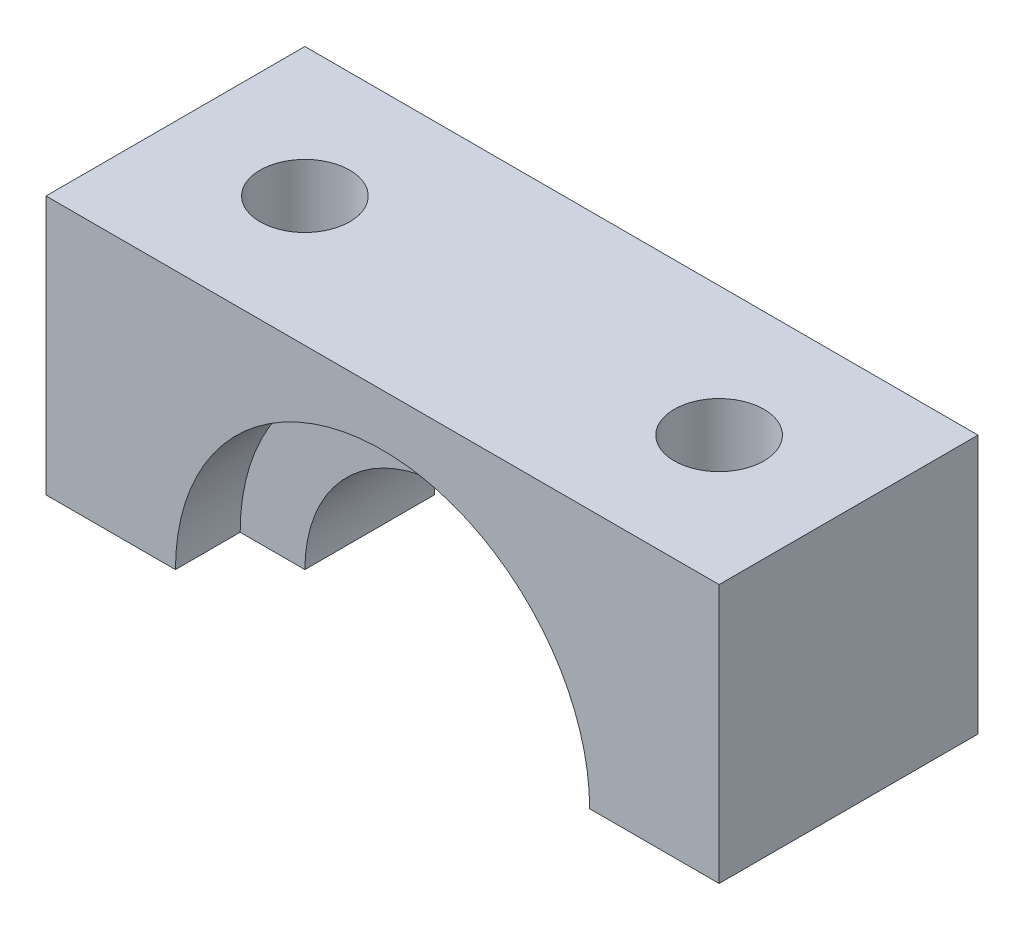
ISO-10303-21;
HEADER;
FILE_DESCRIPTION(('STEP AP214'),'2;1');
FILE_NAME('part.step','',(''),(''),'','','');
FILE_SCHEMA(('AUTOMOTIVE_DESIGN { 1 0 10303 214 1 1 1 1 }'));
ENDSEC;
DATA;
#1=APPLICATION_CONTEXT('core data for automotive mechanical design processes');
#2=APPLICATION_PROTOCOL_DEFINITION('international standard','automotive_design',2000,#1);
#3=PRODUCT_CONTEXT('',#1,'mechanical');
#4=PRODUCT('Part','Part','',(#3));
#5=PRODUCT_RELATED_PRODUCT_CATEGORY('part','',(#4));
#6=PRODUCT_DEFINITION_FORMATION('','',#4);
#7=PRODUCT_DEFINITION_CONTEXT('part definition',#1,'design');
#8=PRODUCT_DEFINITION('design','',#6,#7);
#9=PRODUCT_DEFINITION_SHAPE('','',#8);
#10=(LENGTH_UNIT() NAMED_UNIT(*) SI_UNIT(.MILLI.,.METRE.));
#11=(NAMED_UNIT(*) PLANE_ANGLE_UNIT() SI_UNIT($,.RADIAN.));
#12=(NAMED_UNIT(*) SI_UNIT($,.STERADIAN.) SOLID_ANGLE_UNIT());
#13=UNCERTAINTY_MEASURE_WITH_UNIT(LENGTH_MEASURE(1.E-05),#10,'distance_accuracy_value','');
#14=(GEOMETRIC_REPRESENTATION_CONTEXT(3) GLOBAL_UNCERTAINTY_ASSIGNED_CONTEXT((#13)) GLOBAL_UNIT_ASSIGNED_CONTEXT((#10,
#11,#12)) REPRESENTATION_CONTEXT('',''));
#15=CARTESIAN_POINT('',(0.,0.,0.));
#16=DIRECTION('',(0.,0.,1.));
#17=DIRECTION('',(1.,0.,0.));
#18=AXIS2_PLACEMENT_3D('',#15,#16,#17);
#19=CARTESIAN_POINT('',(0.,0.,2.5));
#20=DIRECTION('',(0.,0.,1.));
#21=DIRECTION('',(1.,0.,0.));
#22=AXIS2_PLACEMENT_3D('',#19,#20,#21);
#23=PLANE('',#22);
#24=DIRECTION('',(1.,0.,0.));
#25=VECTOR('',#24,1.);
#26=CARTESIAN_POINT('',(13.,0.,2.5));
#27=LINE('',#26,#25);
#28=CARTESIAN_POINT('',(5.5,0.,2.5));
#29=VERTEX_POINT('',#28);
#30=CARTESIAN_POINT('',(8.,0.,2.5));
#31=VERTEX_POINT('',#30);
#32=EDGE_CURVE('E54',#29,#31,#27,.T.);
#33=ORIENTED_EDGE('',*,*,#32,.T.);
#34=CARTESIAN_POINT('',(0.,0.,2.5));
#35=DIRECTION('',(0.,0.,1.));
#36=DIRECTION('',(1.,0.,0.));
#37=AXIS2_PLACEMENT_3D('',#34,#35,#36);
#38=CIRCLE('',#37,8.);
#39=CARTESIAN_POINT('',(-8.,0.,2.5));
#40=VERTEX_POINT('',#39);
#41=EDGE_CURVE('E49',#31,#40,#38,.T.);
#42=ORIENTED_EDGE('',*,*,#41,.T.);
#43=DIRECTION('',(1.,0.,0.));
#44=VECTOR('',#43,1.);
#45=CARTESIAN_POINT('',(-5.5,0.,2.5));
#46=LINE('',#45,#44);
#47=CARTESIAN_POINT('',(-5.5,0.,2.5));
#48=VERTEX_POINT('',#47);
#49=EDGE_CURVE('E173',#40,#48,#46,.T.);
#50=ORIENTED_EDGE('',*,*,#49,.T.);
#51=CARTESIAN_POINT('',(0.,0.,2.5));
#52=DIRECTION('',(0.,0.,-1.));
#53=DIRECTION('',(1.,0.,0.));
#54=AXIS2_PLACEMENT_3D('',#51,#52,#53);
#55=CIRCLE('',#54,5.5);
#56=EDGE_CURVE('E169',#48,#29,#55,.T.);
#57=ORIENTED_EDGE('',*,*,#56,.T.);
#58=EDGE_LOOP('',(#33,#42,#50,#57));
#59=FACE_BOUND('',#58,.T.);
#60=ADVANCED_FACE('F33',(#59),#23,.T.);
#61=CARTESIAN_POINT('',(0.,0.,-2.5));
#62=DIRECTION('',(0.,0.,1.));
#63=DIRECTION('',(1.,0.,0.));
#64=AXIS2_PLACEMENT_3D('',#61,#62,#63);
#65=PLANE('',#64);
#66=CARTESIAN_POINT('',(0.,0.,-2.5));
#67=DIRECTION('',(0.,0.,1.));
#68=DIRECTION('',(1.,0.,0.));
#69=AXIS2_PLACEMENT_3D('',#66,#67,#68);
#70=CIRCLE('',#69,8.);
#71=CARTESIAN_POINT('',(8.,0.,-2.5));
#72=VERTEX_POINT('',#71);
#73=CARTESIAN_POINT('',(-8.,0.,-2.5));
#74=VERTEX_POINT('',#73);
#75=EDGE_CURVE('E11',#72,#74,#70,.T.);
#76=ORIENTED_EDGE('',*,*,#75,.F.);
#77=DIRECTION('',(1.,0.,0.));
#78=VECTOR('',#77,1.);
#79=CARTESIAN_POINT('',(13.,0.,-2.5));
#80=LINE('',#79,#78);
#81=CARTESIAN_POINT('',(5.5,0.,-2.5));
#82=VERTEX_POINT('',#81);
#83=EDGE_CURVE('E178',#82,#72,#80,.T.);
#84=ORIENTED_EDGE('',*,*,#83,.F.);
#85=CARTESIAN_POINT('',(0.,0.,-2.5));
#86=DIRECTION('',(0.,0.,-1.));
#87=DIRECTION('',(1.,0.,0.));
#88=AXIS2_PLACEMENT_3D('',#85,#86,#87);
#89=CIRCLE('',#88,5.5);
#90=CARTESIAN_POINT('',(-5.5,0.,-2.5));
#91=VERTEX_POINT('',#90);
#92=EDGE_CURVE('E168',#91,#82,#89,.T.);
#93=ORIENTED_EDGE('',*,*,#92,.F.);
#94=DIRECTION('',(1.,0.,0.));
#95=VECTOR('',#94,1.);
#96=CARTESIAN_POINT('',(-5.5,0.,-2.5));
#97=LINE('',#96,#95);
#98=EDGE_CURVE('E171',#74,#91,#97,.T.);
#99=ORIENTED_EDGE('',*,*,#98,.F.);
#100=EDGE_LOOP('',(#76,#84,#93,#99));
#101=FACE_BOUND('',#100,.T.);
#102=ADVANCED_FACE('F199',(#101),#65,.F.);
#103=CARTESIAN_POINT('',(0.,0.,2.5));
#104=DIRECTION('',(0.,0.,-1.));
#105=DIRECTION('',(-1.,0.,0.));
#106=AXIS2_PLACEMENT_3D('',#103,#104,#105);
#107=CYLINDRICAL_SURFACE('',#106,5.5);
#108=ORIENTED_EDGE('',*,*,#92,.T.);
#109=DIRECTION('',(0.,0.,-1.));
#110=VECTOR('',#109,1.);
#111=CARTESIAN_POINT('',(5.5,0.,2.5));
#112=LINE('',#111,#110);
#113=EDGE_CURVE('E42',#29,#82,#112,.T.);
#114=ORIENTED_EDGE('',*,*,#113,.F.);
#115=ORIENTED_EDGE('',*,*,#56,.F.);
#116=DIRECTION('',(0.,0.,-1.));
#117=VECTOR('',#116,1.);
#118=CARTESIAN_POINT('',(-5.5,0.,2.5));
#119=LINE('',#118,#117);
#120=EDGE_CURVE('E175',#48,#91,#119,.T.);
#121=ORIENTED_EDGE('',*,*,#120,.T.);
#122=EDGE_LOOP('',(#108,#114,#115,#121));
#123=FACE_BOUND('',#122,.T.);
#124=ADVANCED_FACE('F35',(#123),#107,.F.);
#125=CARTESIAN_POINT('',(13.,0.,2.5));
#126=DIRECTION('',(0.,1.,0.));
#127=DIRECTION('',(-1.,0.,0.));
#128=AXIS2_PLACEMENT_3D('',#125,#126,#127);
#129=PLANE('',#128);
#130=CARTESIAN_POINT('',(8.,0.,0.));
#131=DIRECTION('',(0.,-1.,0.));
#132=DIRECTION('',(-1.,0.,0.));
#133=AXIS2_PLACEMENT_3D('',#130,#131,#132);
#134=CIRCLE('',#133,1.7309139379565);
#135=CARTESIAN_POINT('',(6.2690860620435,0.,0.));
#136=VERTEX_POINT('',#135);
#137=EDGE_CURVE('E352',#136,#136,#134,.T.);
#138=ORIENTED_EDGE('',*,*,#137,.F.);
#139=EDGE_LOOP('',(#138));
#140=FACE_BOUND('',#139,.T.);
#141=DIRECTION('',(0.,0.,-1.));
#142=VECTOR('',#141,1.);
#143=CARTESIAN_POINT('',(13.,0.,2.5));
#144=LINE('',#143,#142);
#145=CARTESIAN_POINT('',(13.,0.,5.));
#146=VERTEX_POINT('',#145);
#147=CARTESIAN_POINT('',(13.,0.,-5.));
#148=VERTEX_POINT('',#147);
#149=EDGE_CURVE('E186',#146,#148,#144,.T.);
#150=ORIENTED_EDGE('',*,*,#149,.F.);
#151=DIRECTION('',(1.,0.,0.));
#152=VECTOR('',#151,1.);
#153=CARTESIAN_POINT('',(8.,0.,5.));
#154=LINE('',#153,#152);
#155=CARTESIAN_POINT('',(8.,0.,5.));
#156=VERTEX_POINT('',#155);
#157=EDGE_CURVE('E145',#156,#146,#154,.T.);
#158=ORIENTED_EDGE('',*,*,#157,.F.);
#159=DIRECTION('',(0.,0.,-1.));
#160=VECTOR('',#159,1.);
#161=CARTESIAN_POINT('',(8.,0.,5.));
#162=LINE('',#161,#160);
#163=EDGE_CURVE('E160',#156,#31,#162,.T.);
#164=ORIENTED_EDGE('',*,*,#163,.T.);
#165=ORIENTED_EDGE('',*,*,#32,.F.);
#166=ORIENTED_EDGE('',*,*,#113,.T.);
#167=ORIENTED_EDGE('',*,*,#83,.T.);
#168=CARTESIAN_POINT('',(8.,0.,-5.));
#169=VERTEX_POINT('',#168);
#170=EDGE_CURVE('E148',#72,#169,#162,.T.);
#171=ORIENTED_EDGE('',*,*,#170,.T.);
#172=DIRECTION('',(1.,0.,0.));
#173=VECTOR('',#172,1.);
#174=CARTESIAN_POINT('',(8.,0.,-5.));
#175=LINE('',#174,#173);
#176=EDGE_CURVE('E136',#169,#148,#175,.T.);
#177=ORIENTED_EDGE('',*,*,#176,.T.);
#178=EDGE_LOOP('',(#150,#158,#164,#165,#166,#167,#171,#177));
#179=FACE_BOUND('',#178,.T.);
#180=ADVANCED_FACE('F191',(#140,#179),#129,.F.);
#181=CARTESIAN_POINT('',(13.,10.,2.5));
#182=DIRECTION('',(-1.,0.,0.));
#183=DIRECTION('',(0.,0.,1.));
#184=AXIS2_PLACEMENT_3D('',#181,#182,#183);
#185=PLANE('',#184);
#186=ORIENTED_EDGE('',*,*,#149,.T.);
#187=DIRECTION('',(0.,1.,0.));
#188=VECTOR('',#187,1.);
#189=CARTESIAN_POINT('',(13.,0.,-5.));
#190=LINE('',#189,#188);
#191=CARTESIAN_POINT('',(13.,10.,-5.));
#192=VERTEX_POINT('',#191);
#193=EDGE_CURVE('E133',#148,#192,#190,.T.);
#194=ORIENTED_EDGE('',*,*,#193,.T.);
#195=DIRECTION('',(0.,0.,-1.));
#196=VECTOR('',#195,1.);
#197=CARTESIAN_POINT('',(13.,10.,2.5));
#198=LINE('',#197,#196);
#199=CARTESIAN_POINT('',(13.,10.,5.));
#200=VERTEX_POINT('',#199);
#201=EDGE_CURVE('E118',#200,#192,#198,.T.);
#202=ORIENTED_EDGE('',*,*,#201,.F.);
#203=DIRECTION('',(0.,1.,0.));
#204=VECTOR('',#203,1.);
#205=CARTESIAN_POINT('',(13.,0.,5.));
#206=LINE('',#205,#204);
#207=EDGE_CURVE('E132',#146,#200,#206,.T.);
#208=ORIENTED_EDGE('',*,*,#207,.F.);
#209=EDGE_LOOP('',(#186,#194,#202,#208));
#210=FACE_BOUND('',#209,.T.);
#211=ADVANCED_FACE('F215',(#210),#185,.F.);
#212=CARTESIAN_POINT('',(-13.,10.,2.5));
#213=DIRECTION('',(0.,-1.,0.));
#214=DIRECTION('',(1.,0.,0.));
#215=AXIS2_PLACEMENT_3D('',#212,#213,#214);
#216=PLANE('',#215);
#217=CARTESIAN_POINT('',(8.,10.,0.));
#218=DIRECTION('',(0.,-1.,0.));
#219=DIRECTION('',(1.,0.,0.));
#220=AXIS2_PLACEMENT_3D('',#217,#218,#219);
#221=CIRCLE('',#220,1.7309139379565);
#222=CARTESIAN_POINT('',(9.7309139379565,10.,0.));
#223=VERTEX_POINT('',#222);
#224=EDGE_CURVE('E37',#223,#223,#221,.T.);
#225=ORIENTED_EDGE('',*,*,#224,.T.);
#226=EDGE_LOOP('',(#225));
#227=FACE_BOUND('',#226,.T.);
#228=CARTESIAN_POINT('',(-8.,10.,0.));
#229=DIRECTION('',(0.,-1.,0.));
#230=DIRECTION('',(1.,0.,0.));
#231=AXIS2_PLACEMENT_3D('',#228,#229,#230);
#232=CIRCLE('',#231,1.7309139379565);
#233=CARTESIAN_POINT('',(-6.26908606204351,10.,0.));
#234=VERTEX_POINT('',#233);
#235=EDGE_CURVE('E139',#234,#234,#232,.T.);
#236=ORIENTED_EDGE('',*,*,#235,.T.);
#237=EDGE_LOOP('',(#236));
#238=FACE_BOUND('',#237,.T.);
#239=ORIENTED_EDGE('',*,*,#201,.T.);
#240=DIRECTION('',(-1.,0.,0.));
#241=VECTOR('',#240,1.);
#242=CARTESIAN_POINT('',(13.,10.,-5.));
#243=LINE('',#242,#241);
#244=CARTESIAN_POINT('',(-13.,10.,-5.));
#245=VERTEX_POINT('',#244);
#246=EDGE_CURVE('E114',#192,#245,#243,.T.);
#247=ORIENTED_EDGE('',*,*,#246,.T.);
#248=DIRECTION('',(0.,0.,-1.));
#249=VECTOR('',#248,1.);
#250=CARTESIAN_POINT('',(-13.,10.,2.5));
#251=LINE('',#250,#249);
#252=CARTESIAN_POINT('',(-13.,10.,5.));
#253=VERTEX_POINT('',#252);
#254=EDGE_CURVE('E108',#253,#245,#251,.T.);
#255=ORIENTED_EDGE('',*,*,#254,.F.);
#256=DIRECTION('',(-1.,0.,0.));
#257=VECTOR('',#256,1.);
#258=CARTESIAN_POINT('',(13.,10.,5.));
#259=LINE('',#258,#257);
#260=EDGE_CURVE('E112',#200,#253,#259,.T.);
#261=ORIENTED_EDGE('',*,*,#260,.F.);
#262=EDGE_LOOP('',(#239,#247,#255,#261));
#263=FACE_BOUND('',#262,.T.);
#264=ADVANCED_FACE('F110',(#227,#238,#263),#216,.F.);
#265=CARTESIAN_POINT('',(-13.,0.,2.5));
#266=DIRECTION('',(1.,0.,0.));
#267=DIRECTION('',(0.,0.,-1.));
#268=AXIS2_PLACEMENT_3D('',#265,#266,#267);
#269=PLANE('',#268);
#270=ORIENTED_EDGE('',*,*,#254,.T.);
#271=DIRECTION('',(0.,-1.,0.));
#272=VECTOR('',#271,1.);
#273=CARTESIAN_POINT('',(-13.,10.,-5.));
#274=LINE('',#273,#272);
#275=CARTESIAN_POINT('',(-13.,0.,-5.));
#276=VERTEX_POINT('',#275);
#277=EDGE_CURVE('E150',#245,#276,#274,.T.);
#278=ORIENTED_EDGE('',*,*,#277,.T.);
#279=DIRECTION('',(0.,0.,-1.));
#280=VECTOR('',#279,1.);
#281=CARTESIAN_POINT('',(-13.,0.,2.5));
#282=LINE('',#281,#280);
#283=CARTESIAN_POINT('',(-13.,0.,5.));
#284=VERTEX_POINT('',#283);
#285=EDGE_CURVE('E119',#284,#276,#282,.T.);
#286=ORIENTED_EDGE('',*,*,#285,.F.);
#287=DIRECTION('',(0.,-1.,0.));
#288=VECTOR('',#287,1.);
#289=CARTESIAN_POINT('',(-13.,10.,5.));
#290=LINE('',#289,#288);
#291=EDGE_CURVE('E122',#253,#284,#290,.T.);
#292=ORIENTED_EDGE('',*,*,#291,.F.);
#293=EDGE_LOOP('',(#270,#278,#286,#292));
#294=FACE_BOUND('',#293,.T.);
#295=ADVANCED_FACE('F123',(#294),#269,.F.);
#296=CARTESIAN_POINT('',(-5.5,0.,2.5));
#297=DIRECTION('',(0.,1.,0.));
#298=DIRECTION('',(-1.,0.,0.));
#299=AXIS2_PLACEMENT_3D('',#296,#297,#298);
#300=PLANE('',#299);
#301=CARTESIAN_POINT('',(-8.,0.,0.));
#302=DIRECTION('',(0.,-1.,0.));
#303=DIRECTION('',(1.,0.,0.));
#304=AXIS2_PLACEMENT_3D('',#301,#302,#303);
#305=CIRCLE('',#304,1.7309139379565);
#306=CARTESIAN_POINT('',(-6.2690860620435,0.,0.));
#307=VERTEX_POINT('',#306);
#308=EDGE_CURVE('E355',#307,#307,#305,.T.);
#309=ORIENTED_EDGE('',*,*,#308,.F.);
#310=EDGE_LOOP('',(#309));
#311=FACE_BOUND('',#310,.T.);
#312=ORIENTED_EDGE('',*,*,#285,.T.);
#313=DIRECTION('',(1.,0.,0.));
#314=VECTOR('',#313,1.);
#315=CARTESIAN_POINT('',(-13.,0.,-5.));
#316=LINE('',#315,#314);
#317=CARTESIAN_POINT('',(-8.,0.,-5.));
#318=VERTEX_POINT('',#317);
#319=EDGE_CURVE('E152',#276,#318,#316,.T.);
#320=ORIENTED_EDGE('',*,*,#319,.T.);
#321=DIRECTION('',(0.,0.,-1.));
#322=VECTOR('',#321,1.);
#323=CARTESIAN_POINT('',(-8.,0.,5.));
#324=LINE('',#323,#322);
#325=EDGE_CURVE('E163',#74,#318,#324,.T.);
#326=ORIENTED_EDGE('',*,*,#325,.F.);
#327=ORIENTED_EDGE('',*,*,#98,.T.);
#328=ORIENTED_EDGE('',*,*,#120,.F.);
#329=ORIENTED_EDGE('',*,*,#49,.F.);
#330=CARTESIAN_POINT('',(-8.,0.,5.));
#331=VERTEX_POINT('',#330);
#332=EDGE_CURVE('E164',#331,#40,#324,.T.);
#333=ORIENTED_EDGE('',*,*,#332,.F.);
#334=DIRECTION('',(1.,0.,0.));
#335=VECTOR('',#334,1.);
#336=CARTESIAN_POINT('',(-13.,0.,5.));
#337=LINE('',#336,#335);
#338=EDGE_CURVE('E126',#284,#331,#337,.T.);
#339=ORIENTED_EDGE('',*,*,#338,.F.);
#340=EDGE_LOOP('',(#312,#320,#326,#327,#328,#329,#333,#339));
#341=FACE_BOUND('',#340,.T.);
#342=ADVANCED_FACE('F204',(#311,#341),#300,.F.);
#343=CARTESIAN_POINT('',(0.,0.,-5.));
#344=DIRECTION('',(0.,0.,1.));
#345=DIRECTION('',(1.,0.,0.));
#346=AXIS2_PLACEMENT_3D('',#343,#344,#345);
#347=PLANE('',#346);
#348=ORIENTED_EDGE('',*,*,#246,.F.);
#349=ORIENTED_EDGE('',*,*,#193,.F.);
#350=ORIENTED_EDGE('',*,*,#176,.F.);
#351=CARTESIAN_POINT('',(0.,0.,-5.));
#352=DIRECTION('',(0.,0.,-1.));
#353=DIRECTION('',(1.,0.,0.));
#354=AXIS2_PLACEMENT_3D('',#351,#352,#353);
#355=CIRCLE('',#354,8.);
#356=EDGE_CURVE('E155',#318,#169,#355,.T.);
#357=ORIENTED_EDGE('',*,*,#356,.F.);
#358=ORIENTED_EDGE('',*,*,#319,.F.);
#359=ORIENTED_EDGE('',*,*,#277,.F.);
#360=EDGE_LOOP('',(#348,#349,#350,#357,#358,#359));
#361=FACE_BOUND('',#360,.T.);
#362=ADVANCED_FACE('F209',(#361),#347,.F.);
#363=CARTESIAN_POINT('',(0.,0.,5.));
#364=DIRECTION('',(0.,0.,-1.));
#365=DIRECTION('',(-1.,0.,0.));
#366=AXIS2_PLACEMENT_3D('',#363,#364,#365);
#367=CYLINDRICAL_SURFACE('',#366,8.);
#368=ORIENTED_EDGE('',*,*,#170,.F.);
#369=ORIENTED_EDGE('',*,*,#75,.T.);
#370=ORIENTED_EDGE('',*,*,#325,.T.);
#371=ORIENTED_EDGE('',*,*,#356,.T.);
#372=EDGE_LOOP('',(#368,#369,#370,#371));
#373=FACE_BOUND('',#372,.T.);
#374=ADVANCED_FACE('F202',(#373),#367,.F.);
#375=ORIENTED_EDGE('',*,*,#41,.F.);
#376=ORIENTED_EDGE('',*,*,#163,.F.);
#377=CARTESIAN_POINT('',(0.,0.,5.));
#378=DIRECTION('',(0.,0.,-1.));
#379=DIRECTION('',(1.,0.,0.));
#380=AXIS2_PLACEMENT_3D('',#377,#378,#379);
#381=CIRCLE('',#380,8.);
#382=EDGE_CURVE('E143',#331,#156,#381,.T.);
#383=ORIENTED_EDGE('',*,*,#382,.F.);
#384=ORIENTED_EDGE('',*,*,#332,.T.);
#385=EDGE_LOOP('',(#375,#376,#383,#384));
#386=FACE_BOUND('',#385,.T.);
#387=ADVANCED_FACE('F232',(#386),#367,.F.);
#388=CARTESIAN_POINT('',(0.,0.,5.));
#389=DIRECTION('',(0.,0.,1.));
#390=DIRECTION('',(1.,0.,0.));
#391=AXIS2_PLACEMENT_3D('',#388,#389,#390);
#392=PLANE('',#391);
#393=ORIENTED_EDGE('',*,*,#260,.T.);
#394=ORIENTED_EDGE('',*,*,#291,.T.);
#395=ORIENTED_EDGE('',*,*,#338,.T.);
#396=ORIENTED_EDGE('',*,*,#382,.T.);
#397=ORIENTED_EDGE('',*,*,#157,.T.);
#398=ORIENTED_EDGE('',*,*,#207,.T.);
#399=EDGE_LOOP('',(#393,#394,#395,#396,#397,#398));
#400=FACE_BOUND('',#399,.T.);
#401=ADVANCED_FACE('F129',(#400),#392,.T.);
#402=CARTESIAN_POINT('',(-8.,15.,0.));
#403=DIRECTION('',(0.,-1.,0.));
#404=DIRECTION('',(1.,0.,0.));
#405=AXIS2_PLACEMENT_3D('',#402,#403,#404);
#406=CYLINDRICAL_SURFACE('',#405,1.7309139379565);
#407=ORIENTED_EDGE('',*,*,#308,.T.);
#408=EDGE_LOOP('',(#407));
#409=FACE_BOUND('',#408,.T.);
#410=ORIENTED_EDGE('',*,*,#235,.F.);
#411=EDGE_LOOP('',(#410));
#412=FACE_BOUND('',#411,.T.);
#413=ADVANCED_FACE('F270',(#409,#412),#406,.F.);
#414=CARTESIAN_POINT('',(8.,15.,0.));
#415=DIRECTION('',(0.,-1.,0.));
#416=DIRECTION('',(1.,0.,0.));
#417=AXIS2_PLACEMENT_3D('',#414,#415,#416);
#418=CYLINDRICAL_SURFACE('',#417,1.7309139379565);
#419=ORIENTED_EDGE('',*,*,#137,.T.);
#420=EDGE_LOOP('',(#419));
#421=FACE_BOUND('',#420,.T.);
#422=ORIENTED_EDGE('',*,*,#224,.F.);
#423=EDGE_LOOP('',(#422));
#424=FACE_BOUND('',#423,.T.);
#425=ADVANCED_FACE('F277',(#421,#424),#418,.F.);
#426=CLOSED_SHELL('',(#60,#102,#124,#180,#211,#264,#295,#342,#362,#374,#387,#401,#413,#425));
#427=MANIFOLD_SOLID_BREP('B2',#426);
#428=ADVANCED_BREP_SHAPE_REPRESENTATION('',(#18,#427),#14);
#429=SHAPE_DEFINITION_REPRESENTATION(#9,#428);
ENDSEC;
END-ISO-10303-21;
